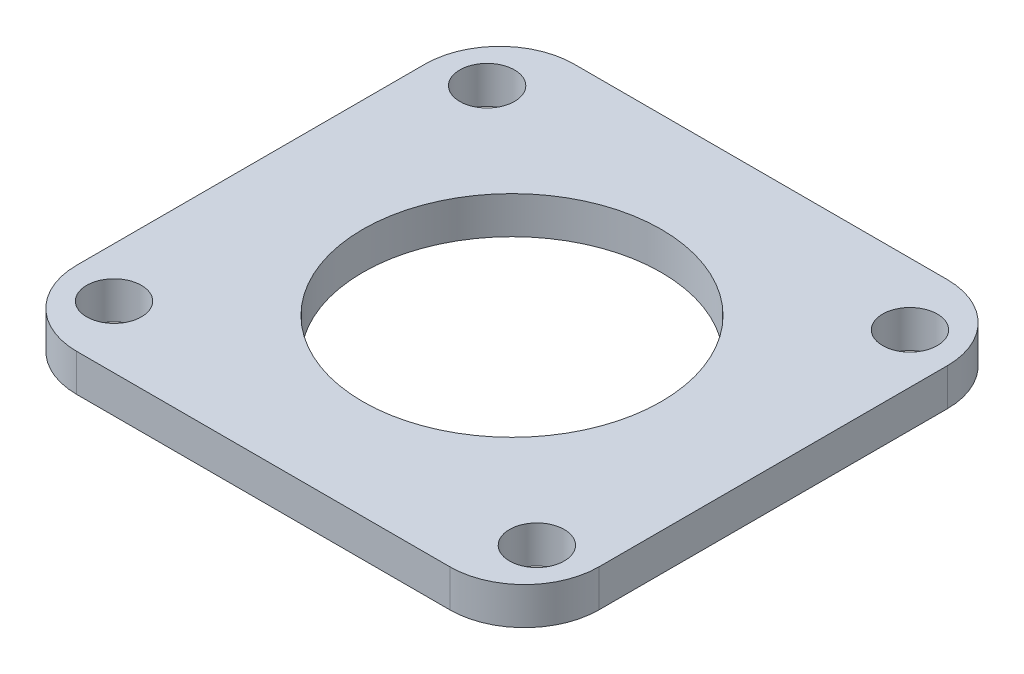
ISO-10303-21;
HEADER;
FILE_DESCRIPTION(('STEP AP214'),'2;1');
FILE_NAME('part.step','',(''),(''),'','','');
FILE_SCHEMA(('AUTOMOTIVE_DESIGN { 1 0 10303 214 1 1 1 1 }'));
ENDSEC;
DATA;
#1=APPLICATION_CONTEXT('core data for automotive mechanical design processes');
#2=APPLICATION_PROTOCOL_DEFINITION('international standard','automotive_design',2000,#1);
#3=PRODUCT_CONTEXT('',#1,'mechanical');
#4=PRODUCT('Part','Part','',(#3));
#5=PRODUCT_RELATED_PRODUCT_CATEGORY('part','',(#4));
#6=PRODUCT_DEFINITION_FORMATION('','',#4);
#7=PRODUCT_DEFINITION_CONTEXT('part definition',#1,'design');
#8=PRODUCT_DEFINITION('design','',#6,#7);
#9=PRODUCT_DEFINITION_SHAPE('','',#8);
#10=(LENGTH_UNIT() NAMED_UNIT(*) SI_UNIT(.MILLI.,.METRE.));
#11=(NAMED_UNIT(*) PLANE_ANGLE_UNIT() SI_UNIT($,.RADIAN.));
#12=(NAMED_UNIT(*) SI_UNIT($,.STERADIAN.) SOLID_ANGLE_UNIT());
#13=UNCERTAINTY_MEASURE_WITH_UNIT(LENGTH_MEASURE(1.E-05),#10,'distance_accuracy_value','');
#14=(GEOMETRIC_REPRESENTATION_CONTEXT(3) GLOBAL_UNCERTAINTY_ASSIGNED_CONTEXT((#13)) GLOBAL_UNIT_ASSIGNED_CONTEXT((#10,
#11,#12)) REPRESENTATION_CONTEXT('',''));
#15=CARTESIAN_POINT('',(0.,0.,0.));
#16=DIRECTION('',(0.,0.,1.));
#17=DIRECTION('',(1.,0.,0.));
#18=AXIS2_PLACEMENT_3D('',#15,#16,#17);
#19=CARTESIAN_POINT('',(0.,1.5,0.));
#20=DIRECTION('',(0.,-1.,0.));
#21=DIRECTION('',(0.,0.,-1.));
#22=AXIS2_PLACEMENT_3D('',#19,#20,#21);
#23=PLANE('',#22);
#24=DIRECTION('',(0.,0.,-1.));
#25=VECTOR('',#24,1.);
#26=CARTESIAN_POINT('',(10.5,1.5,10.));
#27=LINE('',#26,#25);
#28=CARTESIAN_POINT('',(10.5,1.5,7.));
#29=VERTEX_POINT('',#28);
#30=CARTESIAN_POINT('',(10.5,1.5,-7.));
#31=VERTEX_POINT('',#30);
#32=EDGE_CURVE('E136',#29,#31,#27,.T.);
#33=ORIENTED_EDGE('',*,*,#32,.T.);
#34=CARTESIAN_POINT('',(7.5,1.5,-7.));
#35=DIRECTION('',(0.,-1.,0.));
#36=DIRECTION('',(0.,0.,-1.));
#37=AXIS2_PLACEMENT_3D('',#34,#35,#36);
#38=CIRCLE('',#37,3.);
#39=CARTESIAN_POINT('',(7.49999999999999,1.5,-10.));
#40=VERTEX_POINT('',#39);
#41=EDGE_CURVE('E151',#31,#40,#38,.F.);
#42=ORIENTED_EDGE('',*,*,#41,.T.);
#43=DIRECTION('',(-1.,0.,0.));
#44=VECTOR('',#43,1.);
#45=CARTESIAN_POINT('',(-10.5,1.5,-10.));
#46=LINE('',#45,#44);
#47=CARTESIAN_POINT('',(-7.5,1.5,-10.));
#48=VERTEX_POINT('',#47);
#49=EDGE_CURVE('E118',#40,#48,#46,.T.);
#50=ORIENTED_EDGE('',*,*,#49,.T.);
#51=CARTESIAN_POINT('',(-7.5,1.5,-7.));
#52=DIRECTION('',(0.,-1.,0.));
#53=DIRECTION('',(0.,0.,-1.));
#54=AXIS2_PLACEMENT_3D('',#51,#52,#53);
#55=CIRCLE('',#54,3.);
#56=CARTESIAN_POINT('',(-10.5,1.5,-7.));
#57=VERTEX_POINT('',#56);
#58=EDGE_CURVE('E146',#48,#57,#55,.F.);
#59=ORIENTED_EDGE('',*,*,#58,.T.);
#60=DIRECTION('',(0.,0.,1.));
#61=VECTOR('',#60,1.);
#62=CARTESIAN_POINT('',(-10.5,1.5,10.));
#63=LINE('',#62,#61);
#64=CARTESIAN_POINT('',(-10.5,1.5,7.));
#65=VERTEX_POINT('',#64);
#66=EDGE_CURVE('E162',#57,#65,#63,.T.);
#67=ORIENTED_EDGE('',*,*,#66,.T.);
#68=CARTESIAN_POINT('',(-7.5,1.5,7.));
#69=DIRECTION('',(0.,-1.,0.));
#70=DIRECTION('',(0.,0.,-1.));
#71=AXIS2_PLACEMENT_3D('',#68,#69,#70);
#72=CIRCLE('',#71,3.);
#73=CARTESIAN_POINT('',(-7.5,1.5,10.));
#74=VERTEX_POINT('',#73);
#75=EDGE_CURVE('E54',#65,#74,#72,.F.);
#76=ORIENTED_EDGE('',*,*,#75,.T.);
#77=DIRECTION('',(1.,0.,0.));
#78=VECTOR('',#77,1.);
#79=CARTESIAN_POINT('',(-10.5,1.5,10.));
#80=LINE('',#79,#78);
#81=CARTESIAN_POINT('',(7.49999999999999,1.5,10.));
#82=VERTEX_POINT('',#81);
#83=EDGE_CURVE('E137',#74,#82,#80,.T.);
#84=ORIENTED_EDGE('',*,*,#83,.T.);
#85=CARTESIAN_POINT('',(7.5,1.5,7.));
#86=DIRECTION('',(0.,-1.,0.));
#87=DIRECTION('',(0.,0.,-1.));
#88=AXIS2_PLACEMENT_3D('',#85,#86,#87);
#89=CIRCLE('',#88,3.);
#90=EDGE_CURVE('E149',#82,#29,#89,.F.);
#91=ORIENTED_EDGE('',*,*,#90,.T.);
#92=EDGE_LOOP('',(#33,#42,#50,#59,#67,#76,#84,#91));
#93=FACE_BOUND('',#92,.T.);
#94=CARTESIAN_POINT('',(8.5,1.5,-7.5));
#95=DIRECTION('',(0.,1.,0.));
#96=DIRECTION('',(0.,0.,1.));
#97=AXIS2_PLACEMENT_3D('',#94,#95,#96);
#98=CIRCLE('',#97,1.1);
#99=CARTESIAN_POINT('',(8.5,1.5,-6.4));
#100=VERTEX_POINT('',#99);
#101=EDGE_CURVE('E131',#100,#100,#98,.T.);
#102=ORIENTED_EDGE('',*,*,#101,.F.);
#103=EDGE_LOOP('',(#102));
#104=FACE_BOUND('',#103,.T.);
#105=CARTESIAN_POINT('',(-8.5,1.5,-7.5));
#106=DIRECTION('',(0.,1.,0.));
#107=DIRECTION('',(0.,0.,1.));
#108=AXIS2_PLACEMENT_3D('',#105,#106,#107);
#109=CIRCLE('',#108,1.1);
#110=CARTESIAN_POINT('',(-8.5,1.5,-6.4));
#111=VERTEX_POINT('',#110);
#112=EDGE_CURVE('E179',#111,#111,#109,.T.);
#113=ORIENTED_EDGE('',*,*,#112,.F.);
#114=EDGE_LOOP('',(#113));
#115=FACE_BOUND('',#114,.T.);
#116=CARTESIAN_POINT('',(-8.5,1.5,7.5));
#117=DIRECTION('',(0.,1.,0.));
#118=DIRECTION('',(0.,0.,1.));
#119=AXIS2_PLACEMENT_3D('',#116,#117,#118);
#120=CIRCLE('',#119,1.1);
#121=CARTESIAN_POINT('',(-8.5,1.5,8.6));
#122=VERTEX_POINT('',#121);
#123=EDGE_CURVE('E185',#122,#122,#120,.T.);
#124=ORIENTED_EDGE('',*,*,#123,.F.);
#125=EDGE_LOOP('',(#124));
#126=FACE_BOUND('',#125,.T.);
#127=CARTESIAN_POINT('',(8.5,1.5,7.5));
#128=DIRECTION('',(0.,1.,0.));
#129=DIRECTION('',(0.,0.,1.));
#130=AXIS2_PLACEMENT_3D('',#127,#128,#129);
#131=CIRCLE('',#130,1.1);
#132=CARTESIAN_POINT('',(8.5,1.5,8.6));
#133=VERTEX_POINT('',#132);
#134=EDGE_CURVE('E191',#133,#133,#131,.T.);
#135=ORIENTED_EDGE('',*,*,#134,.F.);
#136=EDGE_LOOP('',(#135));
#137=FACE_BOUND('',#136,.T.);
#138=CARTESIAN_POINT('',(0.,1.5,0.));
#139=DIRECTION('',(0.,1.,0.));
#140=DIRECTION('',(0.,0.,1.));
#141=AXIS2_PLACEMENT_3D('',#138,#139,#140);
#142=CIRCLE('',#141,6.);
#143=CARTESIAN_POINT('',(0.,1.5,6.));
#144=VERTEX_POINT('',#143);
#145=EDGE_CURVE('E197',#144,#144,#142,.T.);
#146=ORIENTED_EDGE('',*,*,#145,.F.);
#147=EDGE_LOOP('',(#146));
#148=FACE_BOUND('',#147,.T.);
#149=ADVANCED_FACE('F32',(#93,#104,#115,#126,#137,#148),#23,.F.);
#150=CARTESIAN_POINT('',(0.,0.,0.));
#151=DIRECTION('',(0.,-1.,0.));
#152=DIRECTION('',(0.,0.,-1.));
#153=AXIS2_PLACEMENT_3D('',#150,#151,#152);
#154=PLANE('',#153);
#155=CARTESIAN_POINT('',(8.5,0.,7.5));
#156=DIRECTION('',(0.,1.,0.));
#157=DIRECTION('',(0.,0.,1.));
#158=AXIS2_PLACEMENT_3D('',#155,#156,#157);
#159=CIRCLE('',#158,1.1);
#160=CARTESIAN_POINT('',(8.5,0.,8.6));
#161=VERTEX_POINT('',#160);
#162=EDGE_CURVE('E194',#161,#161,#159,.T.);
#163=ORIENTED_EDGE('',*,*,#162,.T.);
#164=EDGE_LOOP('',(#163));
#165=FACE_BOUND('',#164,.T.);
#166=CARTESIAN_POINT('',(-8.5,0.,-7.5));
#167=DIRECTION('',(0.,1.,0.));
#168=DIRECTION('',(0.,0.,1.));
#169=AXIS2_PLACEMENT_3D('',#166,#167,#168);
#170=CIRCLE('',#169,1.1);
#171=CARTESIAN_POINT('',(-8.5,0.,-6.4));
#172=VERTEX_POINT('',#171);
#173=EDGE_CURVE('E182',#172,#172,#170,.T.);
#174=ORIENTED_EDGE('',*,*,#173,.T.);
#175=EDGE_LOOP('',(#174));
#176=FACE_BOUND('',#175,.T.);
#177=DIRECTION('',(-1.,0.,0.));
#178=VECTOR('',#177,1.);
#179=CARTESIAN_POINT('',(-10.5,0.,-10.));
#180=LINE('',#179,#178);
#181=CARTESIAN_POINT('',(7.49999999999999,0.,-10.));
#182=VERTEX_POINT('',#181);
#183=CARTESIAN_POINT('',(-7.5,0.,-10.));
#184=VERTEX_POINT('',#183);
#185=EDGE_CURVE('E115',#182,#184,#180,.T.);
#186=ORIENTED_EDGE('',*,*,#185,.F.);
#187=CARTESIAN_POINT('',(7.5,0.,-7.));
#188=DIRECTION('',(0.,-1.,0.));
#189=DIRECTION('',(0.,0.,-1.));
#190=AXIS2_PLACEMENT_3D('',#187,#188,#189);
#191=CIRCLE('',#190,3.);
#192=CARTESIAN_POINT('',(10.5,0.,-7.));
#193=VERTEX_POINT('',#192);
#194=EDGE_CURVE('E98',#182,#193,#191,.T.);
#195=ORIENTED_EDGE('',*,*,#194,.T.);
#196=DIRECTION('',(0.,0.,-1.));
#197=VECTOR('',#196,1.);
#198=CARTESIAN_POINT('',(10.5,0.,10.));
#199=LINE('',#198,#197);
#200=CARTESIAN_POINT('',(10.5,0.,7.));
#201=VERTEX_POINT('',#200);
#202=EDGE_CURVE('E126',#201,#193,#199,.T.);
#203=ORIENTED_EDGE('',*,*,#202,.F.);
#204=CARTESIAN_POINT('',(7.5,0.,7.));
#205=DIRECTION('',(0.,-1.,0.));
#206=DIRECTION('',(0.,0.,-1.));
#207=AXIS2_PLACEMENT_3D('',#204,#205,#206);
#208=CIRCLE('',#207,3.);
#209=CARTESIAN_POINT('',(7.49999999999999,0.,10.));
#210=VERTEX_POINT('',#209);
#211=EDGE_CURVE('E109',#201,#210,#208,.T.);
#212=ORIENTED_EDGE('',*,*,#211,.T.);
#213=DIRECTION('',(1.,0.,0.));
#214=VECTOR('',#213,1.);
#215=CARTESIAN_POINT('',(-10.5,0.,10.));
#216=LINE('',#215,#214);
#217=CARTESIAN_POINT('',(-7.5,0.,10.));
#218=VERTEX_POINT('',#217);
#219=EDGE_CURVE('E129',#218,#210,#216,.T.);
#220=ORIENTED_EDGE('',*,*,#219,.F.);
#221=CARTESIAN_POINT('',(-7.5,0.,7.));
#222=DIRECTION('',(0.,-1.,0.));
#223=DIRECTION('',(0.,0.,-1.));
#224=AXIS2_PLACEMENT_3D('',#221,#222,#223);
#225=CIRCLE('',#224,3.);
#226=CARTESIAN_POINT('',(-10.5,0.,7.));
#227=VERTEX_POINT('',#226);
#228=EDGE_CURVE('E140',#218,#227,#225,.T.);
#229=ORIENTED_EDGE('',*,*,#228,.T.);
#230=DIRECTION('',(0.,0.,1.));
#231=VECTOR('',#230,1.);
#232=CARTESIAN_POINT('',(-10.5,0.,10.));
#233=LINE('',#232,#231);
#234=CARTESIAN_POINT('',(-10.5,0.,-7.));
#235=VERTEX_POINT('',#234);
#236=EDGE_CURVE('E125',#235,#227,#233,.T.);
#237=ORIENTED_EDGE('',*,*,#236,.F.);
#238=CARTESIAN_POINT('',(-7.5,0.,-7.));
#239=DIRECTION('',(0.,-1.,0.));
#240=DIRECTION('',(0.,0.,-1.));
#241=AXIS2_PLACEMENT_3D('',#238,#239,#240);
#242=CIRCLE('',#241,3.);
#243=EDGE_CURVE('E119',#235,#184,#242,.T.);
#244=ORIENTED_EDGE('',*,*,#243,.T.);
#245=EDGE_LOOP('',(#186,#195,#203,#212,#220,#229,#237,#244));
#246=FACE_BOUND('',#245,.T.);
#247=CARTESIAN_POINT('',(8.5,0.,-7.5));
#248=DIRECTION('',(0.,1.,0.));
#249=DIRECTION('',(0.,0.,1.));
#250=AXIS2_PLACEMENT_3D('',#247,#248,#249);
#251=CIRCLE('',#250,1.1);
#252=CARTESIAN_POINT('',(8.5,0.,-6.4));
#253=VERTEX_POINT('',#252);
#254=EDGE_CURVE('E176',#253,#253,#251,.T.);
#255=ORIENTED_EDGE('',*,*,#254,.T.);
#256=EDGE_LOOP('',(#255));
#257=FACE_BOUND('',#256,.T.);
#258=CARTESIAN_POINT('',(-8.5,0.,7.5));
#259=DIRECTION('',(0.,1.,0.));
#260=DIRECTION('',(0.,0.,1.));
#261=AXIS2_PLACEMENT_3D('',#258,#259,#260);
#262=CIRCLE('',#261,1.1);
#263=CARTESIAN_POINT('',(-8.5,0.,8.6));
#264=VERTEX_POINT('',#263);
#265=EDGE_CURVE('E188',#264,#264,#262,.T.);
#266=ORIENTED_EDGE('',*,*,#265,.T.);
#267=EDGE_LOOP('',(#266));
#268=FACE_BOUND('',#267,.T.);
#269=CARTESIAN_POINT('',(0.,0.,0.));
#270=DIRECTION('',(0.,1.,0.));
#271=DIRECTION('',(0.,0.,1.));
#272=AXIS2_PLACEMENT_3D('',#269,#270,#271);
#273=CIRCLE('',#272,6.);
#274=CARTESIAN_POINT('',(0.,0.,6.));
#275=VERTEX_POINT('',#274);
#276=EDGE_CURVE('E200',#275,#275,#273,.T.);
#277=ORIENTED_EDGE('',*,*,#276,.T.);
#278=EDGE_LOOP('',(#277));
#279=FACE_BOUND('',#278,.T.);
#280=ADVANCED_FACE('F122',(#165,#176,#246,#257,#268,#279),#154,.T.);
#281=CARTESIAN_POINT('',(10.5,1.5,10.));
#282=DIRECTION('',(-1.,0.,0.));
#283=DIRECTION('',(0.,0.,1.));
#284=AXIS2_PLACEMENT_3D('',#281,#282,#283);
#285=PLANE('',#284);
#286=ORIENTED_EDGE('',*,*,#202,.T.);
#287=DIRECTION('',(0.,-1.,0.));
#288=VECTOR('',#287,1.);
#289=CARTESIAN_POINT('',(10.5,1.5,-7.));
#290=LINE('',#289,#288);
#291=EDGE_CURVE('E103',#193,#31,#290,.F.);
#292=ORIENTED_EDGE('',*,*,#291,.T.);
#293=ORIENTED_EDGE('',*,*,#32,.F.);
#294=DIRECTION('',(0.,-1.,0.));
#295=VECTOR('',#294,1.);
#296=CARTESIAN_POINT('',(10.5,1.5,7.));
#297=LINE('',#296,#295);
#298=EDGE_CURVE('E108',#29,#201,#297,.T.);
#299=ORIENTED_EDGE('',*,*,#298,.T.);
#300=EDGE_LOOP('',(#286,#292,#293,#299));
#301=FACE_BOUND('',#300,.T.);
#302=ADVANCED_FACE('F214',(#301),#285,.F.);
#303=CARTESIAN_POINT('',(-10.5,1.5,-10.));
#304=DIRECTION('',(0.,0.,1.));
#305=DIRECTION('',(1.,0.,0.));
#306=AXIS2_PLACEMENT_3D('',#303,#304,#305);
#307=PLANE('',#306);
#308=ORIENTED_EDGE('',*,*,#49,.F.);
#309=DIRECTION('',(0.,-1.,0.));
#310=VECTOR('',#309,1.);
#311=CARTESIAN_POINT('',(7.5,1.5,-10.));
#312=LINE('',#311,#310);
#313=EDGE_CURVE('E102',#40,#182,#312,.T.);
#314=ORIENTED_EDGE('',*,*,#313,.T.);
#315=ORIENTED_EDGE('',*,*,#185,.T.);
#316=DIRECTION('',(0.,-1.,0.));
#317=VECTOR('',#316,1.);
#318=CARTESIAN_POINT('',(-7.5,1.5,-10.));
#319=LINE('',#318,#317);
#320=EDGE_CURVE('E120',#184,#48,#319,.F.);
#321=ORIENTED_EDGE('',*,*,#320,.T.);
#322=EDGE_LOOP('',(#308,#314,#315,#321));
#323=FACE_BOUND('',#322,.T.);
#324=ADVANCED_FACE('F114',(#323),#307,.F.);
#325=CARTESIAN_POINT('',(-10.5,1.5,10.));
#326=DIRECTION('',(1.,0.,0.));
#327=DIRECTION('',(0.,0.,-1.));
#328=AXIS2_PLACEMENT_3D('',#325,#326,#327);
#329=PLANE('',#328);
#330=ORIENTED_EDGE('',*,*,#236,.T.);
#331=DIRECTION('',(0.,-1.,0.));
#332=VECTOR('',#331,1.);
#333=CARTESIAN_POINT('',(-10.5,1.5,7.));
#334=LINE('',#333,#332);
#335=EDGE_CURVE('E11',#227,#65,#334,.F.);
#336=ORIENTED_EDGE('',*,*,#335,.T.);
#337=ORIENTED_EDGE('',*,*,#66,.F.);
#338=DIRECTION('',(0.,-1.,0.));
#339=VECTOR('',#338,1.);
#340=CARTESIAN_POINT('',(-10.5,1.5,-7.));
#341=LINE('',#340,#339);
#342=EDGE_CURVE('E40',#57,#235,#341,.T.);
#343=ORIENTED_EDGE('',*,*,#342,.T.);
#344=EDGE_LOOP('',(#330,#336,#337,#343));
#345=FACE_BOUND('',#344,.T.);
#346=ADVANCED_FACE('F160',(#345),#329,.F.);
#347=CARTESIAN_POINT('',(-10.5,1.5,10.));
#348=DIRECTION('',(0.,0.,-1.));
#349=DIRECTION('',(-1.,0.,0.));
#350=AXIS2_PLACEMENT_3D('',#347,#348,#349);
#351=PLANE('',#350);
#352=ORIENTED_EDGE('',*,*,#219,.T.);
#353=DIRECTION('',(0.,-1.,0.));
#354=VECTOR('',#353,1.);
#355=CARTESIAN_POINT('',(7.5,1.5,10.));
#356=LINE('',#355,#354);
#357=EDGE_CURVE('E47',#210,#82,#356,.F.);
#358=ORIENTED_EDGE('',*,*,#357,.T.);
#359=ORIENTED_EDGE('',*,*,#83,.F.);
#360=DIRECTION('',(0.,-1.,0.));
#361=VECTOR('',#360,1.);
#362=CARTESIAN_POINT('',(-7.5,1.5,10.));
#363=LINE('',#362,#361);
#364=EDGE_CURVE('E153',#74,#218,#363,.T.);
#365=ORIENTED_EDGE('',*,*,#364,.T.);
#366=EDGE_LOOP('',(#352,#358,#359,#365));
#367=FACE_BOUND('',#366,.T.);
#368=ADVANCED_FACE('F169',(#367),#351,.F.);
#369=CARTESIAN_POINT('',(8.5,1.5,-7.5));
#370=DIRECTION('',(0.,-1.,0.));
#371=DIRECTION('',(0.,0.,-1.));
#372=AXIS2_PLACEMENT_3D('',#369,#370,#371);
#373=CYLINDRICAL_SURFACE('',#372,1.1);
#374=ORIENTED_EDGE('',*,*,#101,.T.);
#375=EDGE_LOOP('',(#374));
#376=FACE_BOUND('',#375,.T.);
#377=ORIENTED_EDGE('',*,*,#254,.F.);
#378=EDGE_LOOP('',(#377));
#379=FACE_BOUND('',#378,.T.);
#380=ADVANCED_FACE('F219',(#376,#379),#373,.F.);
#381=CARTESIAN_POINT('',(-8.5,1.5,-7.5));
#382=DIRECTION('',(0.,-1.,0.));
#383=DIRECTION('',(0.,0.,-1.));
#384=AXIS2_PLACEMENT_3D('',#381,#382,#383);
#385=CYLINDRICAL_SURFACE('',#384,1.1);
#386=ORIENTED_EDGE('',*,*,#112,.T.);
#387=EDGE_LOOP('',(#386));
#388=FACE_BOUND('',#387,.T.);
#389=ORIENTED_EDGE('',*,*,#173,.F.);
#390=EDGE_LOOP('',(#389));
#391=FACE_BOUND('',#390,.T.);
#392=ADVANCED_FACE('F324',(#388,#391),#385,.F.);
#393=CARTESIAN_POINT('',(-8.5,1.5,7.5));
#394=DIRECTION('',(0.,-1.,0.));
#395=DIRECTION('',(0.,0.,-1.));
#396=AXIS2_PLACEMENT_3D('',#393,#394,#395);
#397=CYLINDRICAL_SURFACE('',#396,1.1);
#398=ORIENTED_EDGE('',*,*,#123,.T.);
#399=EDGE_LOOP('',(#398));
#400=FACE_BOUND('',#399,.T.);
#401=ORIENTED_EDGE('',*,*,#265,.F.);
#402=EDGE_LOOP('',(#401));
#403=FACE_BOUND('',#402,.T.);
#404=ADVANCED_FACE('F314',(#400,#403),#397,.F.);
#405=CARTESIAN_POINT('',(8.5,1.5,7.5));
#406=DIRECTION('',(0.,-1.,0.));
#407=DIRECTION('',(0.,0.,-1.));
#408=AXIS2_PLACEMENT_3D('',#405,#406,#407);
#409=CYLINDRICAL_SURFACE('',#408,1.1);
#410=ORIENTED_EDGE('',*,*,#134,.T.);
#411=EDGE_LOOP('',(#410));
#412=FACE_BOUND('',#411,.T.);
#413=ORIENTED_EDGE('',*,*,#162,.F.);
#414=EDGE_LOOP('',(#413));
#415=FACE_BOUND('',#414,.T.);
#416=ADVANCED_FACE('F305',(#412,#415),#409,.F.);
#417=CARTESIAN_POINT('',(0.,1.5,0.));
#418=DIRECTION('',(0.,-1.,0.));
#419=DIRECTION('',(0.,0.,-1.));
#420=AXIS2_PLACEMENT_3D('',#417,#418,#419);
#421=CYLINDRICAL_SURFACE('',#420,6.);
#422=ORIENTED_EDGE('',*,*,#145,.T.);
#423=EDGE_LOOP('',(#422));
#424=FACE_BOUND('',#423,.T.);
#425=ORIENTED_EDGE('',*,*,#276,.F.);
#426=EDGE_LOOP('',(#425));
#427=FACE_BOUND('',#426,.T.);
#428=ADVANCED_FACE('F206',(#424,#427),#421,.F.);
#429=CARTESIAN_POINT('',(7.5,1.5,-7.));
#430=DIRECTION('',(0.,-1.,0.));
#431=DIRECTION('',(0.,0.,-1.));
#432=AXIS2_PLACEMENT_3D('',#429,#430,#431);
#433=CYLINDRICAL_SURFACE('',#432,3.);
#434=ORIENTED_EDGE('',*,*,#41,.F.);
#435=ORIENTED_EDGE('',*,*,#291,.F.);
#436=ORIENTED_EDGE('',*,*,#194,.F.);
#437=ORIENTED_EDGE('',*,*,#313,.F.);
#438=EDGE_LOOP('',(#434,#435,#436,#437));
#439=FACE_BOUND('',#438,.T.);
#440=ADVANCED_FACE('F101',(#439),#433,.T.);
#441=CARTESIAN_POINT('',(7.5,1.5,7.));
#442=DIRECTION('',(0.,-1.,0.));
#443=DIRECTION('',(0.,0.,-1.));
#444=AXIS2_PLACEMENT_3D('',#441,#442,#443);
#445=CYLINDRICAL_SURFACE('',#444,3.);
#446=ORIENTED_EDGE('',*,*,#90,.F.);
#447=ORIENTED_EDGE('',*,*,#357,.F.);
#448=ORIENTED_EDGE('',*,*,#211,.F.);
#449=ORIENTED_EDGE('',*,*,#298,.F.);
#450=EDGE_LOOP('',(#446,#447,#448,#449));
#451=FACE_BOUND('',#450,.T.);
#452=ADVANCED_FACE('F233',(#451),#445,.T.);
#453=CARTESIAN_POINT('',(-7.5,1.5,7.));
#454=DIRECTION('',(0.,-1.,0.));
#455=DIRECTION('',(0.,0.,-1.));
#456=AXIS2_PLACEMENT_3D('',#453,#454,#455);
#457=CYLINDRICAL_SURFACE('',#456,3.);
#458=ORIENTED_EDGE('',*,*,#75,.F.);
#459=ORIENTED_EDGE('',*,*,#335,.F.);
#460=ORIENTED_EDGE('',*,*,#228,.F.);
#461=ORIENTED_EDGE('',*,*,#364,.F.);
#462=EDGE_LOOP('',(#458,#459,#460,#461));
#463=FACE_BOUND('',#462,.T.);
#464=ADVANCED_FACE('F168',(#463),#457,.T.);
#465=CARTESIAN_POINT('',(-7.5,1.5,-7.));
#466=DIRECTION('',(0.,-1.,0.));
#467=DIRECTION('',(0.,0.,-1.));
#468=AXIS2_PLACEMENT_3D('',#465,#466,#467);
#469=CYLINDRICAL_SURFACE('',#468,3.);
#470=ORIENTED_EDGE('',*,*,#58,.F.);
#471=ORIENTED_EDGE('',*,*,#320,.F.);
#472=ORIENTED_EDGE('',*,*,#243,.F.);
#473=ORIENTED_EDGE('',*,*,#342,.F.);
#474=EDGE_LOOP('',(#470,#471,#472,#473));
#475=FACE_BOUND('',#474,.T.);
#476=ADVANCED_FACE('F34',(#475),#469,.T.);
#477=CLOSED_SHELL('',(#149,#280,#302,#324,#346,#368,#380,#392,#404,#416,#428,#440,#452,#464,#476));
#478=MANIFOLD_SOLID_BREP('B2',#477);
#479=ADVANCED_BREP_SHAPE_REPRESENTATION('',(#18,#478),#14);
#480=SHAPE_DEFINITION_REPRESENTATION(#9,#479);
ENDSEC;
END-ISO-10303-21;
